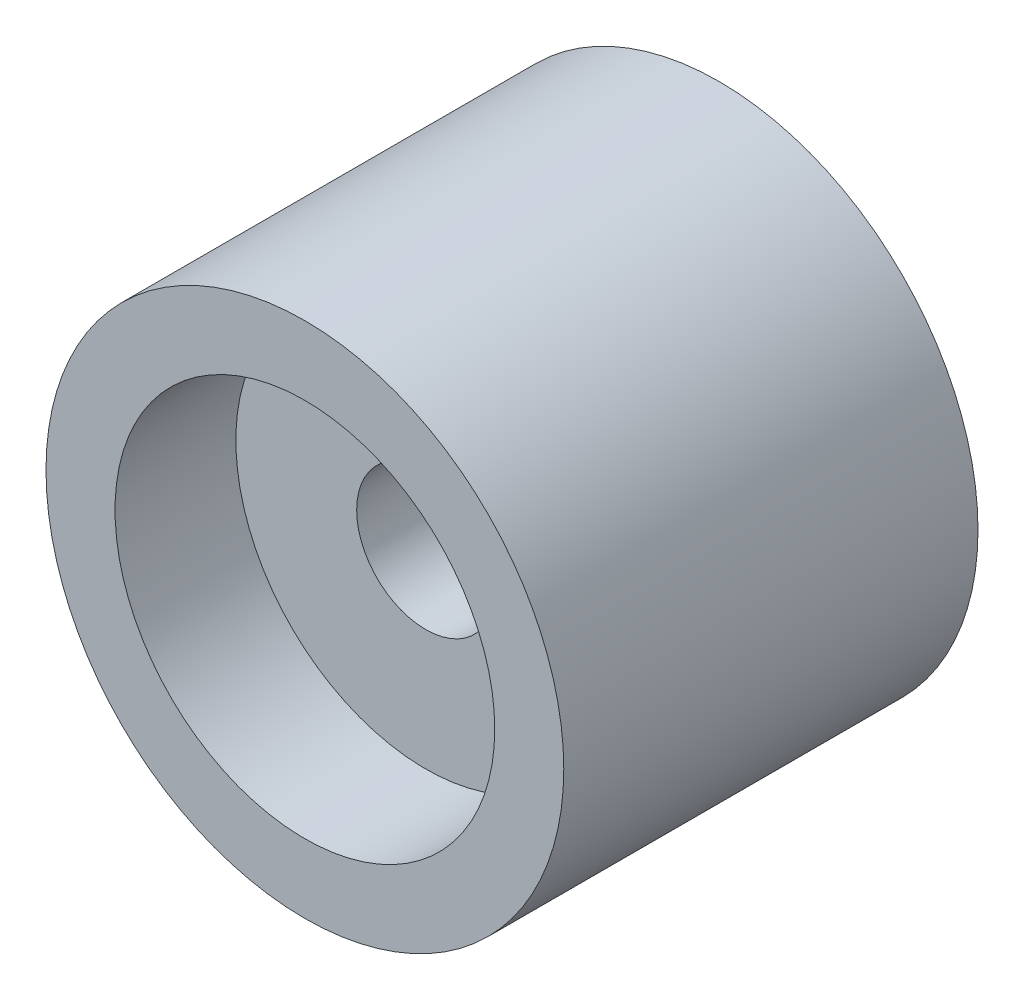
ISO-10303-21;
HEADER;
FILE_DESCRIPTION(('STEP AP214'),'2;1');
FILE_NAME('part.step','',(''),(''),'','','');
FILE_SCHEMA(('AUTOMOTIVE_DESIGN { 1 0 10303 214 1 1 1 1 }'));
ENDSEC;
DATA;
#1=APPLICATION_CONTEXT('core data for automotive mechanical design processes');
#2=APPLICATION_PROTOCOL_DEFINITION('international standard','automotive_design',2000,#1);
#3=PRODUCT_CONTEXT('',#1,'mechanical');
#4=PRODUCT('Part','Part','',(#3));
#5=PRODUCT_RELATED_PRODUCT_CATEGORY('part','',(#4));
#6=PRODUCT_DEFINITION_FORMATION('','',#4);
#7=PRODUCT_DEFINITION_CONTEXT('part definition',#1,'design');
#8=PRODUCT_DEFINITION('design','',#6,#7);
#9=PRODUCT_DEFINITION_SHAPE('','',#8);
#10=(LENGTH_UNIT() NAMED_UNIT(*) SI_UNIT(.MILLI.,.METRE.));
#11=(NAMED_UNIT(*) PLANE_ANGLE_UNIT() SI_UNIT($,.RADIAN.));
#12=(NAMED_UNIT(*) SI_UNIT($,.STERADIAN.) SOLID_ANGLE_UNIT());
#13=UNCERTAINTY_MEASURE_WITH_UNIT(LENGTH_MEASURE(1.E-05),#10,'distance_accuracy_value','');
#14=(GEOMETRIC_REPRESENTATION_CONTEXT(3) GLOBAL_UNCERTAINTY_ASSIGNED_CONTEXT((#13)) GLOBAL_UNIT_ASSIGNED_CONTEXT((#10,
#11,#12)) REPRESENTATION_CONTEXT('',''));
#15=CARTESIAN_POINT('',(0.,0.,0.));
#16=DIRECTION('',(0.,0.,1.));
#17=DIRECTION('',(1.,0.,0.));
#18=AXIS2_PLACEMENT_3D('',#15,#16,#17);
#19=CARTESIAN_POINT('',(0.,0.,24.));
#20=DIRECTION('',(0.,0.,-1.));
#21=DIRECTION('',(-1.,0.,0.));
#22=AXIS2_PLACEMENT_3D('',#19,#20,#21);
#23=CYLINDRICAL_SURFACE('',#22,4.);
#24=CARTESIAN_POINT('',(0.,0.,17.));
#25=DIRECTION('',(0.,0.,1.));
#26=DIRECTION('',(1.,0.,0.));
#27=AXIS2_PLACEMENT_3D('',#24,#25,#26);
#28=CIRCLE('',#27,4.);
#29=CARTESIAN_POINT('',(4.,0.,17.));
#30=VERTEX_POINT('',#29);
#31=EDGE_CURVE('E41',#30,#30,#28,.T.);
#32=ORIENTED_EDGE('',*,*,#31,.T.);
#33=EDGE_LOOP('',(#32));
#34=FACE_BOUND('',#33,.T.);
#35=CARTESIAN_POINT('',(0.,0.,7.));
#36=DIRECTION('',(0.,0.,-1.));
#37=DIRECTION('',(-1.,0.,0.));
#38=AXIS2_PLACEMENT_3D('',#35,#36,#37);
#39=CIRCLE('',#38,4.);
#40=CARTESIAN_POINT('',(-4.,0.,7.));
#41=VERTEX_POINT('',#40);
#42=EDGE_CURVE('E32',#41,#41,#39,.T.);
#43=ORIENTED_EDGE('',*,*,#42,.T.);
#44=EDGE_LOOP('',(#43));
#45=FACE_BOUND('',#44,.T.);
#46=ADVANCED_FACE('F28',(#34,#45),#23,.F.);
#47=CARTESIAN_POINT('',(0.,0.,24.));
#48=DIRECTION('',(0.,0.,1.));
#49=DIRECTION('',(1.,0.,0.));
#50=AXIS2_PLACEMENT_3D('',#47,#48,#49);
#51=PLANE('',#50);
#52=CARTESIAN_POINT('',(0.,0.,24.));
#53=DIRECTION('',(0.,0.,1.));
#54=DIRECTION('',(1.,0.,0.));
#55=AXIS2_PLACEMENT_3D('',#52,#53,#54);
#56=CIRCLE('',#55,11.);
#57=CARTESIAN_POINT('',(11.,0.,24.));
#58=VERTEX_POINT('',#57);
#59=EDGE_CURVE('E44',#58,#58,#56,.T.);
#60=ORIENTED_EDGE('',*,*,#59,.F.);
#61=EDGE_LOOP('',(#60));
#62=FACE_BOUND('',#61,.T.);
#63=CARTESIAN_POINT('',(0.,0.,24.));
#64=DIRECTION('',(0.,0.,1.));
#65=DIRECTION('',(1.,0.,0.));
#66=AXIS2_PLACEMENT_3D('',#63,#64,#65);
#67=CIRCLE('',#66,15.);
#68=CARTESIAN_POINT('',(15.,0.,24.));
#69=VERTEX_POINT('',#68);
#70=EDGE_CURVE('E10',#69,#69,#67,.T.);
#71=ORIENTED_EDGE('',*,*,#70,.T.);
#72=EDGE_LOOP('',(#71));
#73=FACE_BOUND('',#72,.T.);
#74=ADVANCED_FACE('F77',(#62,#73),#51,.T.);
#75=CARTESIAN_POINT('',(0.,0.,0.));
#76=DIRECTION('',(0.,0.,1.));
#77=DIRECTION('',(1.,0.,0.));
#78=AXIS2_PLACEMENT_3D('',#75,#76,#77);
#79=PLANE('',#78);
#80=CARTESIAN_POINT('',(0.,0.,0.));
#81=DIRECTION('',(0.,0.,-1.));
#82=DIRECTION('',(-1.,0.,0.));
#83=AXIS2_PLACEMENT_3D('',#80,#81,#82);
#84=CIRCLE('',#83,11.);
#85=CARTESIAN_POINT('',(-11.,0.,0.));
#86=VERTEX_POINT('',#85);
#87=EDGE_CURVE('E55',#86,#86,#84,.T.);
#88=ORIENTED_EDGE('',*,*,#87,.F.);
#89=EDGE_LOOP('',(#88));
#90=FACE_BOUND('',#89,.T.);
#91=CARTESIAN_POINT('',(0.,0.,0.));
#92=DIRECTION('',(0.,0.,1.));
#93=DIRECTION('',(1.,0.,0.));
#94=AXIS2_PLACEMENT_3D('',#91,#92,#93);
#95=CIRCLE('',#94,15.);
#96=CARTESIAN_POINT('',(15.,0.,0.));
#97=VERTEX_POINT('',#96);
#98=EDGE_CURVE('E36',#97,#97,#95,.T.);
#99=ORIENTED_EDGE('',*,*,#98,.F.);
#100=EDGE_LOOP('',(#99));
#101=FACE_BOUND('',#100,.T.);
#102=ADVANCED_FACE('F82',(#90,#101),#79,.F.);
#103=CARTESIAN_POINT('',(0.,0.,24.));
#104=DIRECTION('',(0.,0.,-1.));
#105=DIRECTION('',(-1.,0.,0.));
#106=AXIS2_PLACEMENT_3D('',#103,#104,#105);
#107=CYLINDRICAL_SURFACE('',#106,15.);
#108=ORIENTED_EDGE('',*,*,#70,.F.);
#109=EDGE_LOOP('',(#108));
#110=FACE_BOUND('',#109,.T.);
#111=ORIENTED_EDGE('',*,*,#98,.T.);
#112=EDGE_LOOP('',(#111));
#113=FACE_BOUND('',#112,.T.);
#114=ADVANCED_FACE('F30',(#110,#113),#107,.T.);
#115=CARTESIAN_POINT('',(0.,0.,17.));
#116=DIRECTION('',(0.,0.,1.));
#117=DIRECTION('',(1.,0.,0.));
#118=AXIS2_PLACEMENT_3D('',#115,#116,#117);
#119=CYLINDRICAL_SURFACE('',#118,11.);
#120=CARTESIAN_POINT('',(0.,0.,17.));
#121=DIRECTION('',(0.,0.,1.));
#122=DIRECTION('',(1.,0.,0.));
#123=AXIS2_PLACEMENT_3D('',#120,#121,#122);
#124=CIRCLE('',#123,11.);
#125=CARTESIAN_POINT('',(11.,0.,17.));
#126=VERTEX_POINT('',#125);
#127=EDGE_CURVE('E47',#126,#126,#124,.T.);
#128=ORIENTED_EDGE('',*,*,#127,.F.);
#129=EDGE_LOOP('',(#128));
#130=FACE_BOUND('',#129,.T.);
#131=ORIENTED_EDGE('',*,*,#59,.T.);
#132=EDGE_LOOP('',(#131));
#133=FACE_BOUND('',#132,.T.);
#134=ADVANCED_FACE('F86',(#130,#133),#119,.F.);
#135=CARTESIAN_POINT('',(0.,0.,17.));
#136=DIRECTION('',(0.,0.,1.));
#137=DIRECTION('',(1.,0.,0.));
#138=AXIS2_PLACEMENT_3D('',#135,#136,#137);
#139=PLANE('',#138);
#140=ORIENTED_EDGE('',*,*,#31,.F.);
#141=EDGE_LOOP('',(#140));
#142=FACE_BOUND('',#141,.T.);
#143=ORIENTED_EDGE('',*,*,#127,.T.);
#144=EDGE_LOOP('',(#143));
#145=FACE_BOUND('',#144,.T.);
#146=ADVANCED_FACE('F73',(#142,#145),#139,.T.);
#147=CARTESIAN_POINT('',(0.,0.,7.));
#148=DIRECTION('',(0.,0.,-1.));
#149=DIRECTION('',(-1.,0.,0.));
#150=AXIS2_PLACEMENT_3D('',#147,#148,#149);
#151=CYLINDRICAL_SURFACE('',#150,11.);
#152=CARTESIAN_POINT('',(0.,0.,7.));
#153=DIRECTION('',(0.,0.,-1.));
#154=DIRECTION('',(-1.,0.,0.));
#155=AXIS2_PLACEMENT_3D('',#152,#153,#154);
#156=CIRCLE('',#155,11.);
#157=CARTESIAN_POINT('',(-11.,0.,7.));
#158=VERTEX_POINT('',#157);
#159=EDGE_CURVE('E58',#158,#158,#156,.T.);
#160=ORIENTED_EDGE('',*,*,#159,.F.);
#161=EDGE_LOOP('',(#160));
#162=FACE_BOUND('',#161,.T.);
#163=ORIENTED_EDGE('',*,*,#87,.T.);
#164=EDGE_LOOP('',(#163));
#165=FACE_BOUND('',#164,.T.);
#166=ADVANCED_FACE('F68',(#162,#165),#151,.F.);
#167=CARTESIAN_POINT('',(0.,0.,7.));
#168=DIRECTION('',(0.,0.,-1.));
#169=DIRECTION('',(-1.,0.,0.));
#170=AXIS2_PLACEMENT_3D('',#167,#168,#169);
#171=PLANE('',#170);
#172=ORIENTED_EDGE('',*,*,#42,.F.);
#173=EDGE_LOOP('',(#172));
#174=FACE_BOUND('',#173,.T.);
#175=ORIENTED_EDGE('',*,*,#159,.T.);
#176=EDGE_LOOP('',(#175));
#177=FACE_BOUND('',#176,.T.);
#178=ADVANCED_FACE('F66',(#174,#177),#171,.T.);
#179=CLOSED_SHELL('',(#46,#74,#102,#114,#134,#146,#166,#178));
#180=MANIFOLD_SOLID_BREP('B2',#179);
#181=ADVANCED_BREP_SHAPE_REPRESENTATION('',(#18,#180),#14);
#182=SHAPE_DEFINITION_REPRESENTATION(#9,#181);
ENDSEC;
END-ISO-10303-21;
